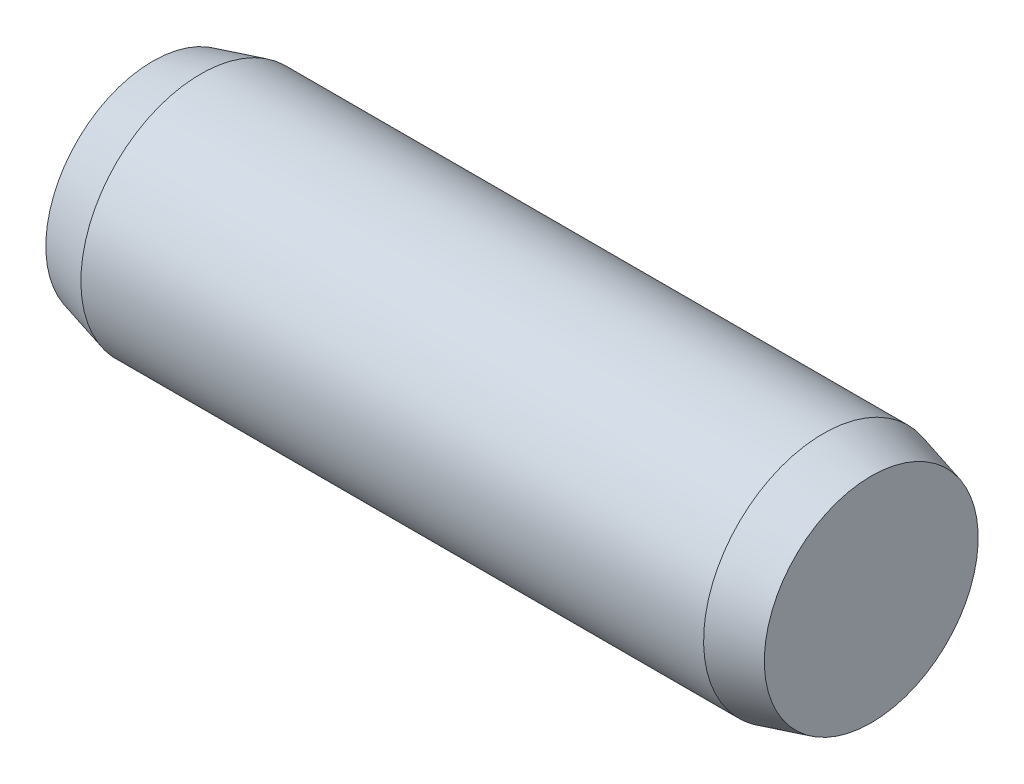
ISO-10303-21;
HEADER;
FILE_DESCRIPTION(('STEP AP214'),'2;1');
FILE_NAME('part.step','',(''),(''),'','','');
FILE_SCHEMA(('AUTOMOTIVE_DESIGN { 1 0 10303 214 1 1 1 1 }'));
ENDSEC;
DATA;
#1=APPLICATION_CONTEXT('core data for automotive mechanical design processes');
#2=APPLICATION_PROTOCOL_DEFINITION('international standard','automotive_design',2000,#1);
#3=PRODUCT_CONTEXT('',#1,'mechanical');
#4=PRODUCT('Part','Part','',(#3));
#5=PRODUCT_RELATED_PRODUCT_CATEGORY('part','',(#4));
#6=PRODUCT_DEFINITION_FORMATION('','',#4);
#7=PRODUCT_DEFINITION_CONTEXT('part definition',#1,'design');
#8=PRODUCT_DEFINITION('design','',#6,#7);
#9=PRODUCT_DEFINITION_SHAPE('','',#8);
#10=(LENGTH_UNIT() NAMED_UNIT(*) SI_UNIT(.MILLI.,.METRE.));
#11=(NAMED_UNIT(*) PLANE_ANGLE_UNIT() SI_UNIT($,.RADIAN.));
#12=(NAMED_UNIT(*) SI_UNIT($,.STERADIAN.) SOLID_ANGLE_UNIT());
#13=UNCERTAINTY_MEASURE_WITH_UNIT(LENGTH_MEASURE(1.E-05),#10,'distance_accuracy_value','');
#14=(GEOMETRIC_REPRESENTATION_CONTEXT(3) GLOBAL_UNCERTAINTY_ASSIGNED_CONTEXT((#13)) GLOBAL_UNIT_ASSIGNED_CONTEXT((#10,
#11,#12)) REPRESENTATION_CONTEXT('',''));
#15=CARTESIAN_POINT('',(0.,0.,0.));
#16=DIRECTION('',(0.,0.,1.));
#17=DIRECTION('',(1.,0.,0.));
#18=AXIS2_PLACEMENT_3D('',#15,#16,#17);
#19=CARTESIAN_POINT('',(30.,4.46410161513775,0.));
#20=DIRECTION('',(-1.,0.,0.));
#21=DIRECTION('',(0.,-1.,0.));
#22=AXIS2_PLACEMENT_3D('',#19,#20,#21);
#23=PLANE('',#22);
#24=CARTESIAN_POINT('',(30.,0.,0.));
#25=DIRECTION('',(-1.,0.,0.));
#26=DIRECTION('',(0.,-1.,0.));
#27=AXIS2_PLACEMENT_3D('',#24,#25,#26);
#28=CIRCLE('',#27,4.46410161513775);
#29=CARTESIAN_POINT('',(30.,-4.46410161513775,0.));
#30=VERTEX_POINT('',#29);
#31=EDGE_CURVE('E10',#30,#30,#28,.T.);
#32=ORIENTED_EDGE('',*,*,#31,.F.);
#33=EDGE_LOOP('',(#32));
#34=FACE_BOUND('',#33,.T.);
#35=ADVANCED_FACE('F30',(#34),#23,.F.);
#36=CARTESIAN_POINT('',(30.,0.,0.));
#37=DIRECTION('',(-1.,0.,0.));
#38=DIRECTION('',(0.,-1.,0.));
#39=AXIS2_PLACEMENT_3D('',#36,#37,#38);
#40=CONICAL_SURFACE('',#39,4.46410161513775,0.26179938779915);
#41=CARTESIAN_POINT('',(28.,0.,0.));
#42=DIRECTION('',(-1.,0.,0.));
#43=DIRECTION('',(0.,-1.,0.));
#44=AXIS2_PLACEMENT_3D('',#41,#42,#43);
#45=CIRCLE('',#44,5.);
#46=CARTESIAN_POINT('',(28.,-5.,0.));
#47=VERTEX_POINT('',#46);
#48=EDGE_CURVE('E36',#47,#47,#45,.T.);
#49=ORIENTED_EDGE('',*,*,#48,.F.);
#50=EDGE_LOOP('',(#49));
#51=FACE_BOUND('',#50,.T.);
#52=ORIENTED_EDGE('',*,*,#31,.T.);
#53=EDGE_LOOP('',(#52));
#54=FACE_BOUND('',#53,.T.);
#55=ADVANCED_FACE('F60',(#51,#54),#40,.T.);
#56=CARTESIAN_POINT('',(0.,0.,0.));
#57=DIRECTION('',(-1.,0.,0.));
#58=DIRECTION('',(0.,-1.,0.));
#59=AXIS2_PLACEMENT_3D('',#56,#57,#58);
#60=CYLINDRICAL_SURFACE('',#59,5.);
#61=CARTESIAN_POINT('',(2.,0.,0.));
#62=DIRECTION('',(-1.,0.,0.));
#63=DIRECTION('',(0.,-1.,0.));
#64=AXIS2_PLACEMENT_3D('',#61,#62,#63);
#65=CIRCLE('',#64,5.);
#66=CARTESIAN_POINT('',(2.,-5.,0.));
#67=VERTEX_POINT('',#66);
#68=EDGE_CURVE('E40',#67,#67,#65,.T.);
#69=ORIENTED_EDGE('',*,*,#68,.F.);
#70=EDGE_LOOP('',(#69));
#71=FACE_BOUND('',#70,.T.);
#72=ORIENTED_EDGE('',*,*,#48,.T.);
#73=EDGE_LOOP('',(#72));
#74=FACE_BOUND('',#73,.T.);
#75=ADVANCED_FACE('F55',(#71,#74),#60,.T.);
#76=CARTESIAN_POINT('',(2.,0.,0.));
#77=DIRECTION('',(1.,0.,0.));
#78=DIRECTION('',(0.,1.,0.));
#79=AXIS2_PLACEMENT_3D('',#76,#77,#78);
#80=CONICAL_SURFACE('',#79,5.,0.261799387799143);
#81=CARTESIAN_POINT('',(0.,0.,0.));
#82=DIRECTION('',(-1.,0.,0.));
#83=DIRECTION('',(0.,-1.,0.));
#84=AXIS2_PLACEMENT_3D('',#81,#82,#83);
#85=CIRCLE('',#84,4.46410161513777);
#86=CARTESIAN_POINT('',(0.,-4.46410161513777,0.));
#87=VERTEX_POINT('',#86);
#88=EDGE_CURVE('E44',#87,#87,#85,.T.);
#89=ORIENTED_EDGE('',*,*,#88,.F.);
#90=EDGE_LOOP('',(#89));
#91=FACE_BOUND('',#90,.T.);
#92=ORIENTED_EDGE('',*,*,#68,.T.);
#93=EDGE_LOOP('',(#92));
#94=FACE_BOUND('',#93,.T.);
#95=ADVANCED_FACE('F52',(#91,#94),#80,.T.);
#96=CARTESIAN_POINT('',(0.,4.46410161513777,0.));
#97=DIRECTION('',(1.,0.,0.));
#98=DIRECTION('',(0.,1.,0.));
#99=AXIS2_PLACEMENT_3D('',#96,#97,#98);
#100=PLANE('',#99);
#101=ORIENTED_EDGE('',*,*,#88,.T.);
#102=EDGE_LOOP('',(#101));
#103=FACE_BOUND('',#102,.T.);
#104=ADVANCED_FACE('F50',(#103),#100,.F.);
#105=CLOSED_SHELL('',(#35,#55,#75,#95,#104));
#106=MANIFOLD_SOLID_BREP('B2',#105);
#107=ADVANCED_BREP_SHAPE_REPRESENTATION('',(#18,#106),#14);
#108=SHAPE_DEFINITION_REPRESENTATION(#9,#107);
ENDSEC;
END-ISO-10303-21;
